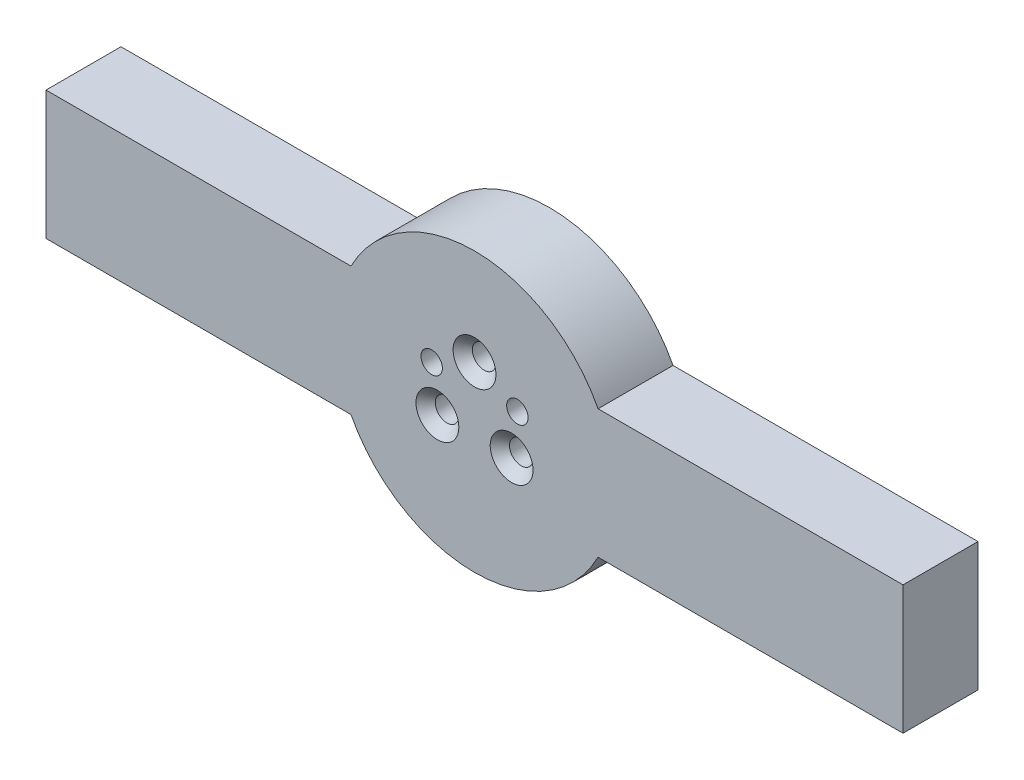
ISO-10303-21;
HEADER;
FILE_DESCRIPTION(('STEP AP214'),'2;1');
FILE_NAME('part.step','',(''),(''),'','','');
FILE_SCHEMA(('AUTOMOTIVE_DESIGN { 1 0 10303 214 1 1 1 1 }'));
ENDSEC;
DATA;
#1=APPLICATION_CONTEXT('core data for automotive mechanical design processes');
#2=APPLICATION_PROTOCOL_DEFINITION('international standard','automotive_design',2000,#1);
#3=PRODUCT_CONTEXT('',#1,'mechanical');
#4=PRODUCT('Part','Part','',(#3));
#5=PRODUCT_RELATED_PRODUCT_CATEGORY('part','',(#4));
#6=PRODUCT_DEFINITION_FORMATION('','',#4);
#7=PRODUCT_DEFINITION_CONTEXT('part definition',#1,'design');
#8=PRODUCT_DEFINITION('design','',#6,#7);
#9=PRODUCT_DEFINITION_SHAPE('','',#8);
#10=(LENGTH_UNIT() NAMED_UNIT(*) SI_UNIT(.MILLI.,.METRE.));
#11=(NAMED_UNIT(*) PLANE_ANGLE_UNIT() SI_UNIT($,.RADIAN.));
#12=(NAMED_UNIT(*) SI_UNIT($,.STERADIAN.) SOLID_ANGLE_UNIT());
#13=UNCERTAINTY_MEASURE_WITH_UNIT(LENGTH_MEASURE(1.E-05),#10,'distance_accuracy_value','');
#14=(GEOMETRIC_REPRESENTATION_CONTEXT(3) GLOBAL_UNCERTAINTY_ASSIGNED_CONTEXT((#13)) GLOBAL_UNIT_ASSIGNED_CONTEXT((#10,
#11,#12)) REPRESENTATION_CONTEXT('',''));
#15=CARTESIAN_POINT('',(0.,0.,0.));
#16=DIRECTION('',(0.,0.,1.));
#17=DIRECTION('',(1.,0.,0.));
#18=AXIS2_PLACEMENT_3D('',#15,#16,#17);
#19=CARTESIAN_POINT('',(-200.,-210.,35.));
#20=DIRECTION('',(1.,0.,0.));
#21=DIRECTION('',(0.,0.,-1.));
#22=AXIS2_PLACEMENT_3D('',#19,#20,#21);
#23=PLANE('',#22);
#24=DIRECTION('',(0.,-1.,0.));
#25=VECTOR('',#24,1.);
#26=CARTESIAN_POINT('',(-200.,-210.,0.));
#27=LINE('',#26,#25);
#28=CARTESIAN_POINT('',(-200.,-210.,0.));
#29=VERTEX_POINT('',#28);
#30=CARTESIAN_POINT('',(-200.,-270.,0.));
#31=VERTEX_POINT('',#30);
#32=EDGE_CURVE('E131',#29,#31,#27,.T.);
#33=ORIENTED_EDGE('',*,*,#32,.T.);
#34=DIRECTION('',(0.,0.,-1.));
#35=VECTOR('',#34,1.);
#36=CARTESIAN_POINT('',(-200.,-270.,35.));
#37=LINE('',#36,#35);
#38=CARTESIAN_POINT('',(-200.,-270.,35.));
#39=VERTEX_POINT('',#38);
#40=EDGE_CURVE('E11',#39,#31,#37,.T.);
#41=ORIENTED_EDGE('',*,*,#40,.F.);
#42=DIRECTION('',(0.,-1.,0.));
#43=VECTOR('',#42,1.);
#44=CARTESIAN_POINT('',(-200.,-210.,35.));
#45=LINE('',#44,#43);
#46=CARTESIAN_POINT('',(-200.,-210.,35.));
#47=VERTEX_POINT('',#46);
#48=EDGE_CURVE('E146',#47,#39,#45,.T.);
#49=ORIENTED_EDGE('',*,*,#48,.F.);
#50=DIRECTION('',(0.,0.,-1.));
#51=VECTOR('',#50,1.);
#52=CARTESIAN_POINT('',(-200.,-210.,35.));
#53=LINE('',#52,#51);
#54=EDGE_CURVE('E127',#47,#29,#53,.T.);
#55=ORIENTED_EDGE('',*,*,#54,.T.);
#56=EDGE_LOOP('',(#33,#41,#49,#55));
#57=FACE_BOUND('',#56,.T.);
#58=ADVANCED_FACE('F33',(#57),#23,.F.);
#59=CARTESIAN_POINT('',(-200.,-270.,35.));
#60=DIRECTION('',(0.,1.,0.));
#61=DIRECTION('',(0.,0.,1.));
#62=AXIS2_PLACEMENT_3D('',#59,#60,#61);
#63=PLANE('',#62);
#64=DIRECTION('',(1.,0.,0.));
#65=VECTOR('',#64,1.);
#66=CARTESIAN_POINT('',(-200.,-270.,0.));
#67=LINE('',#66,#65);
#68=CARTESIAN_POINT('',(-57.6628129733541,-270.,0.));
#69=VERTEX_POINT('',#68);
#70=EDGE_CURVE('E134',#31,#69,#67,.T.);
#71=ORIENTED_EDGE('',*,*,#70,.T.);
#72=DIRECTION('',(0.,0.,-1.));
#73=VECTOR('',#72,1.);
#74=CARTESIAN_POINT('',(-57.6628129733541,-270.,35.));
#75=LINE('',#74,#73);
#76=CARTESIAN_POINT('',(-57.6628129733541,-270.,35.));
#77=VERTEX_POINT('',#76);
#78=EDGE_CURVE('E42',#77,#69,#75,.T.);
#79=ORIENTED_EDGE('',*,*,#78,.F.);
#80=DIRECTION('',(1.,0.,0.));
#81=VECTOR('',#80,1.);
#82=CARTESIAN_POINT('',(-200.,-270.,35.));
#83=LINE('',#82,#81);
#84=EDGE_CURVE('E94',#39,#77,#83,.T.);
#85=ORIENTED_EDGE('',*,*,#84,.F.);
#86=ORIENTED_EDGE('',*,*,#40,.T.);
#87=EDGE_LOOP('',(#71,#79,#85,#86));
#88=FACE_BOUND('',#87,.T.);
#89=ADVANCED_FACE('F219',(#88),#63,.F.);
#90=CARTESIAN_POINT('',(0.,-240.,35.));
#91=DIRECTION('',(0.,0.,-1.));
#92=DIRECTION('',(-1.,0.,0.));
#93=AXIS2_PLACEMENT_3D('',#90,#91,#92);
#94=CYLINDRICAL_SURFACE('',#93,65.);
#95=CARTESIAN_POINT('',(0.,-240.,0.));
#96=DIRECTION('',(0.,0.,1.));
#97=DIRECTION('',(1.,0.,0.));
#98=AXIS2_PLACEMENT_3D('',#95,#96,#97);
#99=CIRCLE('',#98,65.);
#100=CARTESIAN_POINT('',(57.662812973354,-270.,0.));
#101=VERTEX_POINT('',#100);
#102=EDGE_CURVE('E137',#69,#101,#99,.T.);
#103=ORIENTED_EDGE('',*,*,#102,.T.);
#104=DIRECTION('',(0.,0.,-1.));
#105=VECTOR('',#104,1.);
#106=CARTESIAN_POINT('',(57.662812973354,-270.,35.));
#107=LINE('',#106,#105);
#108=CARTESIAN_POINT('',(57.662812973354,-270.,35.));
#109=VERTEX_POINT('',#108);
#110=EDGE_CURVE('E153',#109,#101,#107,.T.);
#111=ORIENTED_EDGE('',*,*,#110,.F.);
#112=CARTESIAN_POINT('',(0.,-240.,35.));
#113=DIRECTION('',(0.,0.,1.));
#114=DIRECTION('',(1.,0.,0.));
#115=AXIS2_PLACEMENT_3D('',#112,#113,#114);
#116=CIRCLE('',#115,65.);
#117=EDGE_CURVE('E187',#77,#109,#116,.T.);
#118=ORIENTED_EDGE('',*,*,#117,.F.);
#119=ORIENTED_EDGE('',*,*,#78,.T.);
#120=EDGE_LOOP('',(#103,#111,#118,#119));
#121=FACE_BOUND('',#120,.T.);
#122=ADVANCED_FACE('F223',(#121),#94,.T.);
#123=CARTESIAN_POINT('',(57.662812973354,-270.,35.));
#124=DIRECTION('',(0.,1.,0.));
#125=DIRECTION('',(0.,0.,1.));
#126=AXIS2_PLACEMENT_3D('',#123,#124,#125);
#127=PLANE('',#126);
#128=DIRECTION('',(1.,0.,0.));
#129=VECTOR('',#128,1.);
#130=CARTESIAN_POINT('',(57.662812973354,-270.,0.));
#131=LINE('',#130,#129);
#132=CARTESIAN_POINT('',(200.,-270.,0.));
#133=VERTEX_POINT('',#132);
#134=EDGE_CURVE('E139',#101,#133,#131,.T.);
#135=ORIENTED_EDGE('',*,*,#134,.T.);
#136=DIRECTION('',(0.,0.,-1.));
#137=VECTOR('',#136,1.);
#138=CARTESIAN_POINT('',(200.,-270.,35.));
#139=LINE('',#138,#137);
#140=CARTESIAN_POINT('',(200.,-270.,35.));
#141=VERTEX_POINT('',#140);
#142=EDGE_CURVE('E150',#141,#133,#139,.T.);
#143=ORIENTED_EDGE('',*,*,#142,.F.);
#144=DIRECTION('',(1.,0.,0.));
#145=VECTOR('',#144,1.);
#146=CARTESIAN_POINT('',(57.662812973354,-270.,35.));
#147=LINE('',#146,#145);
#148=EDGE_CURVE('E189',#109,#141,#147,.T.);
#149=ORIENTED_EDGE('',*,*,#148,.F.);
#150=ORIENTED_EDGE('',*,*,#110,.T.);
#151=EDGE_LOOP('',(#135,#143,#149,#150));
#152=FACE_BOUND('',#151,.T.);
#153=ADVANCED_FACE('F195',(#152),#127,.F.);
#154=CARTESIAN_POINT('',(200.,-270.,35.));
#155=DIRECTION('',(-1.,0.,0.));
#156=DIRECTION('',(0.,0.,1.));
#157=AXIS2_PLACEMENT_3D('',#154,#155,#156);
#158=PLANE('',#157);
#159=DIRECTION('',(0.,1.,0.));
#160=VECTOR('',#159,1.);
#161=CARTESIAN_POINT('',(200.,-270.,0.));
#162=LINE('',#161,#160);
#163=CARTESIAN_POINT('',(200.,-210.,0.));
#164=VERTEX_POINT('',#163);
#165=EDGE_CURVE('E141',#133,#164,#162,.T.);
#166=ORIENTED_EDGE('',*,*,#165,.T.);
#167=DIRECTION('',(0.,0.,-1.));
#168=VECTOR('',#167,1.);
#169=CARTESIAN_POINT('',(200.,-210.,35.));
#170=LINE('',#169,#168);
#171=CARTESIAN_POINT('',(200.,-210.,35.));
#172=VERTEX_POINT('',#171);
#173=EDGE_CURVE('E122',#172,#164,#170,.T.);
#174=ORIENTED_EDGE('',*,*,#173,.F.);
#175=DIRECTION('',(0.,1.,0.));
#176=VECTOR('',#175,1.);
#177=CARTESIAN_POINT('',(200.,-270.,35.));
#178=LINE('',#177,#176);
#179=EDGE_CURVE('E113',#141,#172,#178,.T.);
#180=ORIENTED_EDGE('',*,*,#179,.F.);
#181=ORIENTED_EDGE('',*,*,#142,.T.);
#182=EDGE_LOOP('',(#166,#174,#180,#181));
#183=FACE_BOUND('',#182,.T.);
#184=ADVANCED_FACE('F199',(#183),#158,.F.);
#185=CARTESIAN_POINT('',(200.,-210.,35.));
#186=DIRECTION('',(0.,-1.,0.));
#187=DIRECTION('',(0.,0.,-1.));
#188=AXIS2_PLACEMENT_3D('',#185,#186,#187);
#189=PLANE('',#188);
#190=DIRECTION('',(-1.,0.,0.));
#191=VECTOR('',#190,1.);
#192=CARTESIAN_POINT('',(200.,-210.,0.));
#193=LINE('',#192,#191);
#194=CARTESIAN_POINT('',(57.6628129733539,-210.,0.));
#195=VERTEX_POINT('',#194);
#196=EDGE_CURVE('E121',#164,#195,#193,.T.);
#197=ORIENTED_EDGE('',*,*,#196,.T.);
#198=DIRECTION('',(0.,0.,-1.));
#199=VECTOR('',#198,1.);
#200=CARTESIAN_POINT('',(57.6628129733539,-210.,35.));
#201=LINE('',#200,#199);
#202=CARTESIAN_POINT('',(57.6628129733539,-210.,35.));
#203=VERTEX_POINT('',#202);
#204=EDGE_CURVE('E118',#203,#195,#201,.T.);
#205=ORIENTED_EDGE('',*,*,#204,.F.);
#206=DIRECTION('',(-1.,0.,0.));
#207=VECTOR('',#206,1.);
#208=CARTESIAN_POINT('',(200.,-210.,35.));
#209=LINE('',#208,#207);
#210=EDGE_CURVE('E107',#172,#203,#209,.T.);
#211=ORIENTED_EDGE('',*,*,#210,.F.);
#212=ORIENTED_EDGE('',*,*,#173,.T.);
#213=EDGE_LOOP('',(#197,#205,#211,#212));
#214=FACE_BOUND('',#213,.T.);
#215=ADVANCED_FACE('F119',(#214),#189,.F.);
#216=CARTESIAN_POINT('',(0.,-240.,35.));
#217=DIRECTION('',(0.,0.,-1.));
#218=DIRECTION('',(-1.,0.,0.));
#219=AXIS2_PLACEMENT_3D('',#216,#217,#218);
#220=CYLINDRICAL_SURFACE('',#219,65.);
#221=CARTESIAN_POINT('',(0.,-240.,0.));
#222=DIRECTION('',(0.,0.,1.));
#223=DIRECTION('',(1.,0.,0.));
#224=AXIS2_PLACEMENT_3D('',#221,#222,#223);
#225=CIRCLE('',#224,65.);
#226=CARTESIAN_POINT('',(-57.662812973354,-210.,0.));
#227=VERTEX_POINT('',#226);
#228=EDGE_CURVE('E80',#195,#227,#225,.T.);
#229=ORIENTED_EDGE('',*,*,#228,.T.);
#230=DIRECTION('',(0.,0.,-1.));
#231=VECTOR('',#230,1.);
#232=CARTESIAN_POINT('',(-57.662812973354,-210.,35.));
#233=LINE('',#232,#231);
#234=CARTESIAN_POINT('',(-57.662812973354,-210.,35.));
#235=VERTEX_POINT('',#234);
#236=EDGE_CURVE('E123',#235,#227,#233,.T.);
#237=ORIENTED_EDGE('',*,*,#236,.F.);
#238=CARTESIAN_POINT('',(0.,-240.,35.));
#239=DIRECTION('',(0.,0.,1.));
#240=DIRECTION('',(1.,0.,0.));
#241=AXIS2_PLACEMENT_3D('',#238,#239,#240);
#242=CIRCLE('',#241,65.);
#243=EDGE_CURVE('E111',#203,#235,#242,.T.);
#244=ORIENTED_EDGE('',*,*,#243,.F.);
#245=ORIENTED_EDGE('',*,*,#204,.T.);
#246=EDGE_LOOP('',(#229,#237,#244,#245));
#247=FACE_BOUND('',#246,.T.);
#248=ADVANCED_FACE('F125',(#247),#220,.T.);
#249=CARTESIAN_POINT('',(-57.662812973354,-210.,35.));
#250=DIRECTION('',(0.,-1.,0.));
#251=DIRECTION('',(0.,0.,-1.));
#252=AXIS2_PLACEMENT_3D('',#249,#250,#251);
#253=PLANE('',#252);
#254=DIRECTION('',(-1.,0.,0.));
#255=VECTOR('',#254,1.);
#256=CARTESIAN_POINT('',(-57.662812973354,-210.,0.));
#257=LINE('',#256,#255);
#258=EDGE_CURVE('E86',#227,#29,#257,.T.);
#259=ORIENTED_EDGE('',*,*,#258,.T.);
#260=ORIENTED_EDGE('',*,*,#54,.F.);
#261=DIRECTION('',(-1.,0.,0.));
#262=VECTOR('',#261,1.);
#263=CARTESIAN_POINT('',(-57.662812973354,-210.,35.));
#264=LINE('',#263,#262);
#265=EDGE_CURVE('E51',#235,#47,#264,.T.);
#266=ORIENTED_EDGE('',*,*,#265,.F.);
#267=ORIENTED_EDGE('',*,*,#236,.T.);
#268=EDGE_LOOP('',(#259,#260,#266,#267));
#269=FACE_BOUND('',#268,.T.);
#270=ADVANCED_FACE('F207',(#269),#253,.F.);
#271=CARTESIAN_POINT('',(0.,-240.,35.));
#272=DIRECTION('',(0.,0.,1.));
#273=DIRECTION('',(1.,0.,0.));
#274=AXIS2_PLACEMENT_3D('',#271,#272,#273);
#275=PLANE('',#274);
#276=CARTESIAN_POINT('',(-20.,-230.,35.));
#277=DIRECTION('',(0.,0.,1.));
#278=DIRECTION('',(1.,0.,0.));
#279=AXIS2_PLACEMENT_3D('',#276,#277,#278);
#280=CIRCLE('',#279,5.);
#281=CARTESIAN_POINT('',(-15.,-230.,35.));
#282=VERTEX_POINT('',#281);
#283=EDGE_CURVE('E370',#282,#282,#280,.T.);
#284=ORIENTED_EDGE('',*,*,#283,.F.);
#285=EDGE_LOOP('',(#284));
#286=FACE_BOUND('',#285,.T.);
#287=CARTESIAN_POINT('',(20.,-230.,35.));
#288=DIRECTION('',(0.,0.,1.));
#289=DIRECTION('',(1.,0.,0.));
#290=AXIS2_PLACEMENT_3D('',#287,#288,#289);
#291=CIRCLE('',#290,4.99999999999999);
#292=CARTESIAN_POINT('',(25.,-230.,35.));
#293=VERTEX_POINT('',#292);
#294=EDGE_CURVE('E372',#293,#293,#291,.T.);
#295=ORIENTED_EDGE('',*,*,#294,.F.);
#296=EDGE_LOOP('',(#295));
#297=FACE_BOUND('',#296,.T.);
#298=CARTESIAN_POINT('',(0.,-220.,35.));
#299=DIRECTION('',(0.,0.,1.));
#300=DIRECTION('',(1.,0.,0.));
#301=AXIS2_PLACEMENT_3D('',#298,#299,#300);
#302=CIRCLE('',#301,10.);
#303=CARTESIAN_POINT('',(10.,-220.,35.));
#304=VERTEX_POINT('',#303);
#305=EDGE_CURVE('E380',#304,#304,#302,.T.);
#306=ORIENTED_EDGE('',*,*,#305,.F.);
#307=EDGE_LOOP('',(#306));
#308=FACE_BOUND('',#307,.T.);
#309=CARTESIAN_POINT('',(-17.3205080756888,-250.,35.));
#310=DIRECTION('',(0.,0.,1.));
#311=DIRECTION('',(1.,0.,0.));
#312=AXIS2_PLACEMENT_3D('',#309,#310,#311);
#313=CIRCLE('',#312,10.);
#314=CARTESIAN_POINT('',(-7.32050807568877,-250.,35.));
#315=VERTEX_POINT('',#314);
#316=EDGE_CURVE('E171',#315,#315,#313,.T.);
#317=ORIENTED_EDGE('',*,*,#316,.F.);
#318=EDGE_LOOP('',(#317));
#319=FACE_BOUND('',#318,.T.);
#320=CARTESIAN_POINT('',(17.3205080756887,-250.,35.));
#321=DIRECTION('',(0.,0.,1.));
#322=DIRECTION('',(1.,0.,0.));
#323=AXIS2_PLACEMENT_3D('',#320,#321,#322);
#324=CIRCLE('',#323,10.);
#325=CARTESIAN_POINT('',(27.3205080756887,-250.,35.));
#326=VERTEX_POINT('',#325);
#327=EDGE_CURVE('E164',#326,#326,#324,.T.);
#328=ORIENTED_EDGE('',*,*,#327,.F.);
#329=EDGE_LOOP('',(#328));
#330=FACE_BOUND('',#329,.T.);
#331=ORIENTED_EDGE('',*,*,#48,.T.);
#332=ORIENTED_EDGE('',*,*,#84,.T.);
#333=ORIENTED_EDGE('',*,*,#117,.T.);
#334=ORIENTED_EDGE('',*,*,#148,.T.);
#335=ORIENTED_EDGE('',*,*,#179,.T.);
#336=ORIENTED_EDGE('',*,*,#210,.T.);
#337=ORIENTED_EDGE('',*,*,#243,.T.);
#338=ORIENTED_EDGE('',*,*,#265,.T.);
#339=EDGE_LOOP('',(#331,#332,#333,#334,#335,#336,#337,#338));
#340=FACE_BOUND('',#339,.T.);
#341=ADVANCED_FACE('F109',(#286,#297,#308,#319,#330,#340),#275,.T.);
#342=CARTESIAN_POINT('',(0.,-240.,0.));
#343=DIRECTION('',(0.,0.,1.));
#344=DIRECTION('',(1.,0.,0.));
#345=AXIS2_PLACEMENT_3D('',#342,#343,#344);
#346=PLANE('',#345);
#347=CARTESIAN_POINT('',(0.,-240.,0.));
#348=DIRECTION('',(0.,0.,-1.));
#349=DIRECTION('',(-1.,0.,0.));
#350=AXIS2_PLACEMENT_3D('',#347,#348,#349);
#351=CIRCLE('',#350,35.);
#352=CARTESIAN_POINT('',(-35.,-240.,0.));
#353=VERTEX_POINT('',#352);
#354=EDGE_CURVE('E160',#353,#353,#351,.T.);
#355=ORIENTED_EDGE('',*,*,#354,.F.);
#356=EDGE_LOOP('',(#355));
#357=FACE_BOUND('',#356,.T.);
#358=ORIENTED_EDGE('',*,*,#32,.F.);
#359=ORIENTED_EDGE('',*,*,#258,.F.);
#360=ORIENTED_EDGE('',*,*,#228,.F.);
#361=ORIENTED_EDGE('',*,*,#196,.F.);
#362=ORIENTED_EDGE('',*,*,#165,.F.);
#363=ORIENTED_EDGE('',*,*,#134,.F.);
#364=ORIENTED_EDGE('',*,*,#102,.F.);
#365=ORIENTED_EDGE('',*,*,#70,.F.);
#366=EDGE_LOOP('',(#358,#359,#360,#361,#362,#363,#364,#365));
#367=FACE_BOUND('',#366,.T.);
#368=ADVANCED_FACE('F202',(#357,#367),#346,.F.);
#369=CARTESIAN_POINT('',(0.,-240.,15.));
#370=DIRECTION('',(0.,0.,-1.));
#371=DIRECTION('',(-1.,0.,0.));
#372=AXIS2_PLACEMENT_3D('',#369,#370,#371);
#373=CYLINDRICAL_SURFACE('',#372,35.);
#374=CARTESIAN_POINT('',(0.,-240.,15.));
#375=DIRECTION('',(0.,0.,-1.));
#376=DIRECTION('',(-1.,0.,0.));
#377=AXIS2_PLACEMENT_3D('',#374,#375,#376);
#378=CIRCLE('',#377,35.);
#379=CARTESIAN_POINT('',(-35.,-240.,15.));
#380=VERTEX_POINT('',#379);
#381=EDGE_CURVE('E135',#380,#380,#378,.T.);
#382=ORIENTED_EDGE('',*,*,#381,.F.);
#383=EDGE_LOOP('',(#382));
#384=FACE_BOUND('',#383,.T.);
#385=ORIENTED_EDGE('',*,*,#354,.T.);
#386=EDGE_LOOP('',(#385));
#387=FACE_BOUND('',#386,.T.);
#388=ADVANCED_FACE('F257',(#384,#387),#373,.F.);
#389=CARTESIAN_POINT('',(0.,-240.,15.));
#390=DIRECTION('',(0.,0.,-1.));
#391=DIRECTION('',(-1.,0.,0.));
#392=AXIS2_PLACEMENT_3D('',#389,#390,#391);
#393=PLANE('',#392);
#394=CARTESIAN_POINT('',(-20.,-230.,15.));
#395=DIRECTION('',(0.,0.,-1.));
#396=DIRECTION('',(-1.,0.,0.));
#397=AXIS2_PLACEMENT_3D('',#394,#395,#396);
#398=CIRCLE('',#397,4.99999999999999);
#399=CARTESIAN_POINT('',(-25.,-230.,15.));
#400=VERTEX_POINT('',#399);
#401=EDGE_CURVE('E367',#400,#400,#398,.T.);
#402=ORIENTED_EDGE('',*,*,#401,.F.);
#403=EDGE_LOOP('',(#402));
#404=FACE_BOUND('',#403,.T.);
#405=CARTESIAN_POINT('',(20.,-230.,15.));
#406=DIRECTION('',(0.,0.,-1.));
#407=DIRECTION('',(-1.,0.,0.));
#408=AXIS2_PLACEMENT_3D('',#405,#406,#407);
#409=CIRCLE('',#408,4.99999999999999);
#410=CARTESIAN_POINT('',(15.,-230.,15.));
#411=VERTEX_POINT('',#410);
#412=EDGE_CURVE('E377',#411,#411,#409,.T.);
#413=ORIENTED_EDGE('',*,*,#412,.F.);
#414=EDGE_LOOP('',(#413));
#415=FACE_BOUND('',#414,.T.);
#416=CARTESIAN_POINT('',(0.,-220.,15.));
#417=DIRECTION('',(0.,0.,-1.));
#418=DIRECTION('',(-1.,0.,0.));
#419=AXIS2_PLACEMENT_3D('',#416,#417,#418);
#420=CIRCLE('',#419,5.49999999999999);
#421=CARTESIAN_POINT('',(-5.49999999999999,-220.,15.));
#422=VERTEX_POINT('',#421);
#423=EDGE_CURVE('E36',#422,#422,#420,.T.);
#424=ORIENTED_EDGE('',*,*,#423,.F.);
#425=EDGE_LOOP('',(#424));
#426=FACE_BOUND('',#425,.T.);
#427=CARTESIAN_POINT('',(-17.3205080756888,-250.,15.));
#428=DIRECTION('',(0.,0.,-1.));
#429=DIRECTION('',(-1.,0.,0.));
#430=AXIS2_PLACEMENT_3D('',#427,#428,#429);
#431=CIRCLE('',#430,5.49999999999999);
#432=CARTESIAN_POINT('',(-22.8205080756888,-250.,15.));
#433=VERTEX_POINT('',#432);
#434=EDGE_CURVE('E162',#433,#433,#431,.T.);
#435=ORIENTED_EDGE('',*,*,#434,.F.);
#436=EDGE_LOOP('',(#435));
#437=FACE_BOUND('',#436,.T.);
#438=CARTESIAN_POINT('',(17.3205080756887,-250.,15.));
#439=DIRECTION('',(0.,0.,-1.));
#440=DIRECTION('',(-1.,0.,0.));
#441=AXIS2_PLACEMENT_3D('',#438,#439,#440);
#442=CIRCLE('',#441,5.49999999999999);
#443=CARTESIAN_POINT('',(11.8205080756887,-250.,15.));
#444=VERTEX_POINT('',#443);
#445=EDGE_CURVE('E158',#444,#444,#442,.T.);
#446=ORIENTED_EDGE('',*,*,#445,.F.);
#447=EDGE_LOOP('',(#446));
#448=FACE_BOUND('',#447,.T.);
#449=ORIENTED_EDGE('',*,*,#381,.T.);
#450=EDGE_LOOP('',(#449));
#451=FACE_BOUND('',#450,.T.);
#452=ADVANCED_FACE('F266',(#404,#415,#426,#437,#448,#451),#393,.T.);
#453=CARTESIAN_POINT('',(17.3205080756887,-250.,35.));
#454=DIRECTION('',(0.,0.,1.));
#455=DIRECTION('',(1.,0.,0.));
#456=AXIS2_PLACEMENT_3D('',#453,#454,#455);
#457=CYLINDRICAL_SURFACE('',#456,5.49999999999999);
#458=ORIENTED_EDGE('',*,*,#445,.T.);
#459=EDGE_LOOP('',(#458));
#460=FACE_BOUND('',#459,.T.);
#461=CARTESIAN_POINT('',(17.3205080756887,-250.,30.5));
#462=DIRECTION('',(0.,0.,1.));
#463=DIRECTION('',(1.,0.,0.));
#464=AXIS2_PLACEMENT_3D('',#461,#462,#463);
#465=CIRCLE('',#464,5.49999999999999);
#466=CARTESIAN_POINT('',(22.8205080756887,-250.,30.5));
#467=VERTEX_POINT('',#466);
#468=EDGE_CURVE('E161',#467,#467,#465,.T.);
#469=ORIENTED_EDGE('',*,*,#468,.T.);
#470=EDGE_LOOP('',(#469));
#471=FACE_BOUND('',#470,.T.);
#472=ADVANCED_FACE('F274',(#460,#471),#457,.F.);
#473=CARTESIAN_POINT('',(17.3205080756887,-250.,35.));
#474=DIRECTION('',(0.,0.,1.));
#475=DIRECTION('',(1.,0.,0.));
#476=AXIS2_PLACEMENT_3D('',#473,#474,#475);
#477=CONICAL_SURFACE('',#476,10.,0.785398163397448);
#478=ORIENTED_EDGE('',*,*,#468,.F.);
#479=EDGE_LOOP('',(#478));
#480=FACE_BOUND('',#479,.T.);
#481=ORIENTED_EDGE('',*,*,#327,.T.);
#482=EDGE_LOOP('',(#481));
#483=FACE_BOUND('',#482,.T.);
#484=ADVANCED_FACE('F279',(#480,#483),#477,.F.);
#485=CARTESIAN_POINT('',(-17.3205080756888,-250.,35.));
#486=DIRECTION('',(0.,0.,1.));
#487=DIRECTION('',(1.,0.,0.));
#488=AXIS2_PLACEMENT_3D('',#485,#486,#487);
#489=CYLINDRICAL_SURFACE('',#488,5.49999999999999);
#490=ORIENTED_EDGE('',*,*,#434,.T.);
#491=EDGE_LOOP('',(#490));
#492=FACE_BOUND('',#491,.T.);
#493=CARTESIAN_POINT('',(-17.3205080756888,-250.,30.5));
#494=DIRECTION('',(0.,0.,1.));
#495=DIRECTION('',(1.,0.,0.));
#496=AXIS2_PLACEMENT_3D('',#493,#494,#495);
#497=CIRCLE('',#496,5.49999999999999);
#498=CARTESIAN_POINT('',(-11.8205080756888,-250.,30.5));
#499=VERTEX_POINT('',#498);
#500=EDGE_CURVE('E165',#499,#499,#497,.T.);
#501=ORIENTED_EDGE('',*,*,#500,.T.);
#502=EDGE_LOOP('',(#501));
#503=FACE_BOUND('',#502,.T.);
#504=ADVANCED_FACE('F289',(#492,#503),#489,.F.);
#505=CARTESIAN_POINT('',(-17.3205080756888,-250.,35.));
#506=DIRECTION('',(0.,0.,1.));
#507=DIRECTION('',(1.,0.,0.));
#508=AXIS2_PLACEMENT_3D('',#505,#506,#507);
#509=CONICAL_SURFACE('',#508,10.,0.785398163397448);
#510=ORIENTED_EDGE('',*,*,#500,.F.);
#511=EDGE_LOOP('',(#510));
#512=FACE_BOUND('',#511,.T.);
#513=ORIENTED_EDGE('',*,*,#316,.T.);
#514=EDGE_LOOP('',(#513));
#515=FACE_BOUND('',#514,.T.);
#516=ADVANCED_FACE('F299',(#512,#515),#509,.F.);
#517=CARTESIAN_POINT('',(0.,-220.,35.));
#518=DIRECTION('',(0.,0.,1.));
#519=DIRECTION('',(1.,0.,0.));
#520=AXIS2_PLACEMENT_3D('',#517,#518,#519);
#521=CYLINDRICAL_SURFACE('',#520,5.49999999999999);
#522=ORIENTED_EDGE('',*,*,#423,.T.);
#523=EDGE_LOOP('',(#522));
#524=FACE_BOUND('',#523,.T.);
#525=CARTESIAN_POINT('',(0.,-220.,30.5));
#526=DIRECTION('',(0.,0.,1.));
#527=DIRECTION('',(1.,0.,0.));
#528=AXIS2_PLACEMENT_3D('',#525,#526,#527);
#529=CIRCLE('',#528,5.49999999999999);
#530=CARTESIAN_POINT('',(5.49999999999999,-220.,30.5));
#531=VERTEX_POINT('',#530);
#532=EDGE_CURVE('E382',#531,#531,#529,.T.);
#533=ORIENTED_EDGE('',*,*,#532,.T.);
#534=EDGE_LOOP('',(#533));
#535=FACE_BOUND('',#534,.T.);
#536=ADVANCED_FACE('F308',(#524,#535),#521,.F.);
#537=CARTESIAN_POINT('',(0.,-220.,35.));
#538=DIRECTION('',(0.,0.,1.));
#539=DIRECTION('',(1.,0.,0.));
#540=AXIS2_PLACEMENT_3D('',#537,#538,#539);
#541=CONICAL_SURFACE('',#540,10.,0.785398163397448);
#542=ORIENTED_EDGE('',*,*,#532,.F.);
#543=EDGE_LOOP('',(#542));
#544=FACE_BOUND('',#543,.T.);
#545=ORIENTED_EDGE('',*,*,#305,.T.);
#546=EDGE_LOOP('',(#545));
#547=FACE_BOUND('',#546,.T.);
#548=ADVANCED_FACE('F318',(#544,#547),#541,.F.);
#549=CARTESIAN_POINT('',(20.,-230.,35.));
#550=DIRECTION('',(0.,0.,1.));
#551=DIRECTION('',(1.,0.,0.));
#552=AXIS2_PLACEMENT_3D('',#549,#550,#551);
#553=CYLINDRICAL_SURFACE('',#552,4.99999999999999);
#554=ORIENTED_EDGE('',*,*,#412,.T.);
#555=EDGE_LOOP('',(#554));
#556=FACE_BOUND('',#555,.T.);
#557=ORIENTED_EDGE('',*,*,#294,.T.);
#558=EDGE_LOOP('',(#557));
#559=FACE_BOUND('',#558,.T.);
#560=ADVANCED_FACE('F328',(#556,#559),#553,.F.);
#561=CARTESIAN_POINT('',(-20.,-230.,35.));
#562=DIRECTION('',(0.,0.,1.));
#563=DIRECTION('',(1.,0.,0.));
#564=AXIS2_PLACEMENT_3D('',#561,#562,#563);
#565=CYLINDRICAL_SURFACE('',#564,4.99999999999999);
#566=ORIENTED_EDGE('',*,*,#401,.T.);
#567=EDGE_LOOP('',(#566));
#568=FACE_BOUND('',#567,.T.);
#569=ORIENTED_EDGE('',*,*,#283,.T.);
#570=EDGE_LOOP('',(#569));
#571=FACE_BOUND('',#570,.T.);
#572=ADVANCED_FACE('F350',(#568,#571),#565,.F.);
#573=CLOSED_SHELL('',(#58,#89,#122,#153,#184,#215,#248,#270,#341,#368,#388,#452,#472,#484,#504,
#516,#536,#548,#560,#572));
#574=MANIFOLD_SOLID_BREP('B2',#573);
#575=ADVANCED_BREP_SHAPE_REPRESENTATION('',(#18,#574),#14);
#576=SHAPE_DEFINITION_REPRESENTATION(#9,#575);
ENDSEC;
END-ISO-10303-21;
